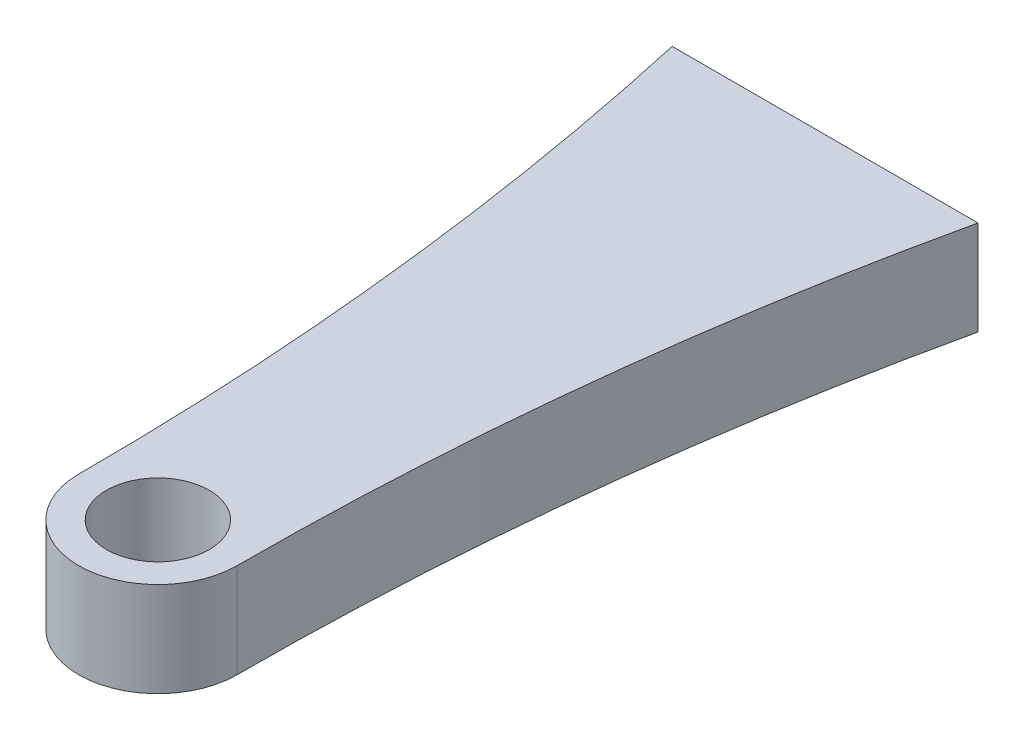
ISO-10303-21;
HEADER;
FILE_DESCRIPTION(('STEP AP214'),'2;1');
FILE_NAME('part.step','',(''),(''),'','','');
FILE_SCHEMA(('AUTOMOTIVE_DESIGN { 1 0 10303 214 1 1 1 1 }'));
ENDSEC;
DATA;
#1=APPLICATION_CONTEXT('core data for automotive mechanical design processes');
#2=APPLICATION_PROTOCOL_DEFINITION('international standard','automotive_design',2000,#1);
#3=PRODUCT_CONTEXT('',#1,'mechanical');
#4=PRODUCT('Part','Part','',(#3));
#5=PRODUCT_RELATED_PRODUCT_CATEGORY('part','',(#4));
#6=PRODUCT_DEFINITION_FORMATION('','',#4);
#7=PRODUCT_DEFINITION_CONTEXT('part definition',#1,'design');
#8=PRODUCT_DEFINITION('design','',#6,#7);
#9=PRODUCT_DEFINITION_SHAPE('','',#8);
#10=(LENGTH_UNIT() NAMED_UNIT(*) SI_UNIT(.MILLI.,.METRE.));
#11=(NAMED_UNIT(*) PLANE_ANGLE_UNIT() SI_UNIT($,.RADIAN.));
#12=(NAMED_UNIT(*) SI_UNIT($,.STERADIAN.) SOLID_ANGLE_UNIT());
#13=UNCERTAINTY_MEASURE_WITH_UNIT(LENGTH_MEASURE(1.E-05),#10,'distance_accuracy_value','');
#14=(GEOMETRIC_REPRESENTATION_CONTEXT(3) GLOBAL_UNCERTAINTY_ASSIGNED_CONTEXT((#13)) GLOBAL_UNIT_ASSIGNED_CONTEXT((#10,
#11,#12)) REPRESENTATION_CONTEXT('',''));
#15=CARTESIAN_POINT('',(0.,0.,0.));
#16=DIRECTION('',(0.,0.,1.));
#17=DIRECTION('',(1.,0.,0.));
#18=AXIS2_PLACEMENT_3D('',#15,#16,#17);
#19=CARTESIAN_POINT('',(716.624457547171,10.795,1.11022302462516E-13));
#20=DIRECTION('',(0.,1.,0.));
#21=DIRECTION('',(0.,0.,1.));
#22=AXIS2_PLACEMENT_3D('',#19,#20,#21);
#23=PLANE('',#22);
#24=CARTESIAN_POINT('',(716.624457547171,10.795,1.11022302462516E-13));
#25=DIRECTION('',(0.,-1.,0.));
#26=DIRECTION('',(0.,0.,1.));
#27=AXIS2_PLACEMENT_3D('',#24,#25,#26);
#28=CIRCLE('',#27,698.526957547171);
#29=CARTESIAN_POINT('',(18.0975,10.795,0.));
#30=VERTEX_POINT('',#29);
#31=CARTESIAN_POINT('',(34.925,10.795,-152.4));
#32=VERTEX_POINT('',#31);
#33=EDGE_CURVE('E89',#30,#32,#28,.T.);
#34=ORIENTED_EDGE('',*,*,#33,.T.);
#35=DIRECTION('',(-1.,0.,0.));
#36=VECTOR('',#35,1.);
#37=CARTESIAN_POINT('',(-34.925,10.795,-152.4));
#38=LINE('',#37,#36);
#39=CARTESIAN_POINT('',(-34.925,10.795,-152.4));
#40=VERTEX_POINT('',#39);
#41=EDGE_CURVE('E84',#32,#40,#38,.T.);
#42=ORIENTED_EDGE('',*,*,#41,.T.);
#43=CARTESIAN_POINT('',(-716.624457547171,10.795,1.11022302462516E-13));
#44=DIRECTION('',(0.,-1.,0.));
#45=DIRECTION('',(0.,0.,-1.));
#46=AXIS2_PLACEMENT_3D('',#43,#44,#45);
#47=CIRCLE('',#46,698.526957547171);
#48=CARTESIAN_POINT('',(-18.0975,10.795,0.));
#49=VERTEX_POINT('',#48);
#50=EDGE_CURVE('E87',#40,#49,#47,.T.);
#51=ORIENTED_EDGE('',*,*,#50,.T.);
#52=CARTESIAN_POINT('',(0.,10.795,0.));
#53=DIRECTION('',(0.,1.,0.));
#54=DIRECTION('',(0.,0.,1.));
#55=AXIS2_PLACEMENT_3D('',#52,#53,#54);
#56=CIRCLE('',#55,18.0975);
#57=EDGE_CURVE('E54',#49,#30,#56,.T.);
#58=ORIENTED_EDGE('',*,*,#57,.T.);
#59=EDGE_LOOP('',(#34,#42,#51,#58));
#60=FACE_BOUND('',#59,.T.);
#61=CARTESIAN_POINT('',(0.,10.795,0.));
#62=DIRECTION('',(0.,1.,0.));
#63=DIRECTION('',(0.,0.,1.));
#64=AXIS2_PLACEMENT_3D('',#61,#62,#63);
#65=CIRCLE('',#64,11.7475);
#66=CARTESIAN_POINT('',(0.,10.795,11.7475));
#67=VERTEX_POINT('',#66);
#68=EDGE_CURVE('E104',#67,#67,#65,.T.);
#69=ORIENTED_EDGE('',*,*,#68,.F.);
#70=EDGE_LOOP('',(#69));
#71=FACE_BOUND('',#70,.T.);
#72=ADVANCED_FACE('F37',(#60,#71),#23,.T.);
#73=CARTESIAN_POINT('',(716.624457547171,-10.795,1.11022302462516E-13));
#74=DIRECTION('',(0.,1.,0.));
#75=DIRECTION('',(0.,0.,1.));
#76=AXIS2_PLACEMENT_3D('',#73,#74,#75);
#77=PLANE('',#76);
#78=CARTESIAN_POINT('',(716.624457547171,-10.795,1.11022302462516E-13));
#79=DIRECTION('',(0.,-1.,0.));
#80=DIRECTION('',(0.,0.,1.));
#81=AXIS2_PLACEMENT_3D('',#78,#79,#80);
#82=CIRCLE('',#81,698.526957547171);
#83=CARTESIAN_POINT('',(18.0975,-10.795,0.));
#84=VERTEX_POINT('',#83);
#85=CARTESIAN_POINT('',(34.925,-10.795,-152.4));
#86=VERTEX_POINT('',#85);
#87=EDGE_CURVE('E101',#84,#86,#82,.T.);
#88=ORIENTED_EDGE('',*,*,#87,.F.);
#89=CARTESIAN_POINT('',(0.,-10.795,0.));
#90=DIRECTION('',(0.,1.,0.));
#91=DIRECTION('',(0.,0.,1.));
#92=AXIS2_PLACEMENT_3D('',#89,#90,#91);
#93=CIRCLE('',#92,18.0975);
#94=CARTESIAN_POINT('',(-18.0975,-10.795,0.));
#95=VERTEX_POINT('',#94);
#96=EDGE_CURVE('E77',#95,#84,#93,.T.);
#97=ORIENTED_EDGE('',*,*,#96,.F.);
#98=CARTESIAN_POINT('',(-716.624457547171,-10.795,1.11022302462516E-13));
#99=DIRECTION('',(0.,-1.,0.));
#100=DIRECTION('',(0.,0.,-1.));
#101=AXIS2_PLACEMENT_3D('',#98,#99,#100);
#102=CIRCLE('',#101,698.526957547171);
#103=CARTESIAN_POINT('',(-34.925,-10.795,-152.4));
#104=VERTEX_POINT('',#103);
#105=EDGE_CURVE('E71',#104,#95,#102,.T.);
#106=ORIENTED_EDGE('',*,*,#105,.F.);
#107=DIRECTION('',(-1.,0.,0.));
#108=VECTOR('',#107,1.);
#109=CARTESIAN_POINT('',(-34.925,-10.795,-152.4));
#110=LINE('',#109,#108);
#111=EDGE_CURVE('E93',#86,#104,#110,.T.);
#112=ORIENTED_EDGE('',*,*,#111,.F.);
#113=EDGE_LOOP('',(#88,#97,#106,#112));
#114=FACE_BOUND('',#113,.T.);
#115=CARTESIAN_POINT('',(0.,-10.795,0.));
#116=DIRECTION('',(0.,1.,0.));
#117=DIRECTION('',(0.,0.,1.));
#118=AXIS2_PLACEMENT_3D('',#115,#116,#117);
#119=CIRCLE('',#118,11.7475);
#120=CARTESIAN_POINT('',(0.,-10.795,11.7475));
#121=VERTEX_POINT('',#120);
#122=EDGE_CURVE('E116',#121,#121,#119,.T.);
#123=ORIENTED_EDGE('',*,*,#122,.T.);
#124=EDGE_LOOP('',(#123));
#125=FACE_BOUND('',#124,.T.);
#126=ADVANCED_FACE('F112',(#114,#125),#77,.F.);
#127=CARTESIAN_POINT('',(716.624457547171,10.795,1.11022302462516E-13));
#128=DIRECTION('',(0.,-1.,0.));
#129=DIRECTION('',(0.,0.,-1.));
#130=AXIS2_PLACEMENT_3D('',#127,#128,#129);
#131=CYLINDRICAL_SURFACE('',#130,698.526957547171);
#132=ORIENTED_EDGE('',*,*,#87,.T.);
#133=DIRECTION('',(0.,-1.,0.));
#134=VECTOR('',#133,1.);
#135=CARTESIAN_POINT('',(34.925,10.795,-152.4));
#136=LINE('',#135,#134);
#137=EDGE_CURVE('E11',#32,#86,#136,.T.);
#138=ORIENTED_EDGE('',*,*,#137,.F.);
#139=ORIENTED_EDGE('',*,*,#33,.F.);
#140=DIRECTION('',(0.,-1.,0.));
#141=VECTOR('',#140,1.);
#142=CARTESIAN_POINT('',(18.0975,10.795,0.));
#143=LINE('',#142,#141);
#144=EDGE_CURVE('E97',#30,#84,#143,.T.);
#145=ORIENTED_EDGE('',*,*,#144,.T.);
#146=EDGE_LOOP('',(#132,#138,#139,#145));
#147=FACE_BOUND('',#146,.T.);
#148=ADVANCED_FACE('F39',(#147),#131,.F.);
#149=CARTESIAN_POINT('',(-34.925,10.795,-152.4));
#150=DIRECTION('',(0.,0.,1.));
#151=DIRECTION('',(1.,0.,0.));
#152=AXIS2_PLACEMENT_3D('',#149,#150,#151);
#153=PLANE('',#152);
#154=ORIENTED_EDGE('',*,*,#111,.T.);
#155=DIRECTION('',(0.,-1.,0.));
#156=VECTOR('',#155,1.);
#157=CARTESIAN_POINT('',(-34.925,10.795,-152.4));
#158=LINE('',#157,#156);
#159=EDGE_CURVE('E46',#40,#104,#158,.T.);
#160=ORIENTED_EDGE('',*,*,#159,.F.);
#161=ORIENTED_EDGE('',*,*,#41,.F.);
#162=ORIENTED_EDGE('',*,*,#137,.T.);
#163=EDGE_LOOP('',(#154,#160,#161,#162));
#164=FACE_BOUND('',#163,.T.);
#165=ADVANCED_FACE('F92',(#164),#153,.F.);
#166=CARTESIAN_POINT('',(-716.624457547171,10.795,1.11022302462516E-13));
#167=DIRECTION('',(0.,-1.,0.));
#168=DIRECTION('',(0.,0.,-1.));
#169=AXIS2_PLACEMENT_3D('',#166,#167,#168);
#170=CYLINDRICAL_SURFACE('',#169,698.526957547171);
#171=ORIENTED_EDGE('',*,*,#105,.T.);
#172=DIRECTION('',(0.,-1.,0.));
#173=VECTOR('',#172,1.);
#174=CARTESIAN_POINT('',(-18.0975,10.795,0.));
#175=LINE('',#174,#173);
#176=EDGE_CURVE('E94',#49,#95,#175,.T.);
#177=ORIENTED_EDGE('',*,*,#176,.F.);
#178=ORIENTED_EDGE('',*,*,#50,.F.);
#179=ORIENTED_EDGE('',*,*,#159,.T.);
#180=EDGE_LOOP('',(#171,#177,#178,#179));
#181=FACE_BOUND('',#180,.T.);
#182=ADVANCED_FACE('F95',(#181),#170,.F.);
#183=CARTESIAN_POINT('',(0.,10.795,0.));
#184=DIRECTION('',(0.,-1.,0.));
#185=DIRECTION('',(0.,0.,-1.));
#186=AXIS2_PLACEMENT_3D('',#183,#184,#185);
#187=CYLINDRICAL_SURFACE('',#186,18.0975);
#188=ORIENTED_EDGE('',*,*,#96,.T.);
#189=ORIENTED_EDGE('',*,*,#144,.F.);
#190=ORIENTED_EDGE('',*,*,#57,.F.);
#191=ORIENTED_EDGE('',*,*,#176,.T.);
#192=EDGE_LOOP('',(#188,#189,#190,#191));
#193=FACE_BOUND('',#192,.T.);
#194=ADVANCED_FACE('F109',(#193),#187,.T.);
#195=CARTESIAN_POINT('',(0.,10.795,0.));
#196=DIRECTION('',(0.,-1.,0.));
#197=DIRECTION('',(0.,0.,-1.));
#198=AXIS2_PLACEMENT_3D('',#195,#196,#197);
#199=CYLINDRICAL_SURFACE('',#198,11.7475);
#200=ORIENTED_EDGE('',*,*,#68,.T.);
#201=EDGE_LOOP('',(#200));
#202=FACE_BOUND('',#201,.T.);
#203=ORIENTED_EDGE('',*,*,#122,.F.);
#204=EDGE_LOOP('',(#203));
#205=FACE_BOUND('',#204,.T.);
#206=ADVANCED_FACE('F122',(#202,#205),#199,.F.);
#207=CLOSED_SHELL('',(#72,#126,#148,#165,#182,#194,#206));
#208=MANIFOLD_SOLID_BREP('B2',#207);
#209=ADVANCED_BREP_SHAPE_REPRESENTATION('',(#18,#208),#14);
#210=SHAPE_DEFINITION_REPRESENTATION(#9,#209);
ENDSEC;
END-ISO-10303-21;
